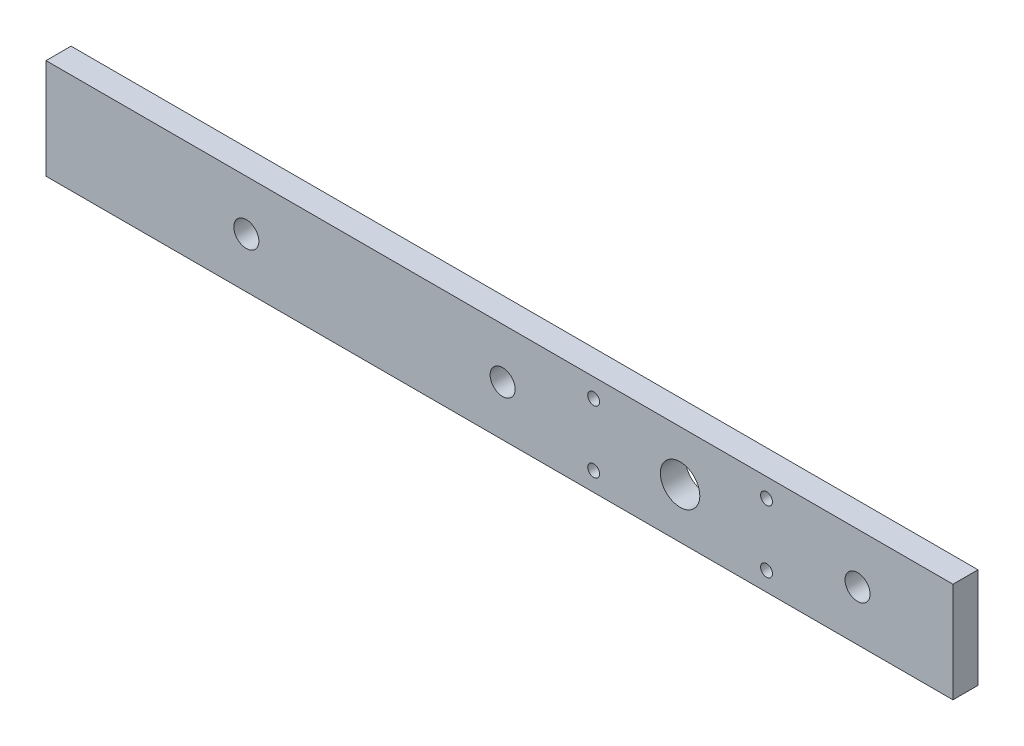
ISO-10303-21;
HEADER;
FILE_DESCRIPTION(('STEP AP214'),'2;1');
FILE_NAME('part.step','',(''),(''),'','','');
FILE_SCHEMA(('AUTOMOTIVE_DESIGN { 1 0 10303 214 1 1 1 1 }'));
ENDSEC;
DATA;
#1=APPLICATION_CONTEXT('core data for automotive mechanical design processes');
#2=APPLICATION_PROTOCOL_DEFINITION('international standard','automotive_design',2000,#1);
#3=PRODUCT_CONTEXT('',#1,'mechanical');
#4=PRODUCT('Part','Part','',(#3));
#5=PRODUCT_RELATED_PRODUCT_CATEGORY('part','',(#4));
#6=PRODUCT_DEFINITION_FORMATION('','',#4);
#7=PRODUCT_DEFINITION_CONTEXT('part definition',#1,'design');
#8=PRODUCT_DEFINITION('design','',#6,#7);
#9=PRODUCT_DEFINITION_SHAPE('','',#8);
#10=(LENGTH_UNIT() NAMED_UNIT(*) SI_UNIT(.MILLI.,.METRE.));
#11=(NAMED_UNIT(*) PLANE_ANGLE_UNIT() SI_UNIT($,.RADIAN.));
#12=(NAMED_UNIT(*) SI_UNIT($,.STERADIAN.) SOLID_ANGLE_UNIT());
#13=UNCERTAINTY_MEASURE_WITH_UNIT(LENGTH_MEASURE(1.E-05),#10,'distance_accuracy_value','');
#14=(GEOMETRIC_REPRESENTATION_CONTEXT(3) GLOBAL_UNCERTAINTY_ASSIGNED_CONTEXT((#13)) GLOBAL_UNIT_ASSIGNED_CONTEXT((#10,
#11,#12)) REPRESENTATION_CONTEXT('',''));
#15=CARTESIAN_POINT('',(0.,0.,0.));
#16=DIRECTION('',(0.,0.,1.));
#17=DIRECTION('',(1.,0.,0.));
#18=AXIS2_PLACEMENT_3D('',#15,#16,#17);
#19=CARTESIAN_POINT('',(304.8,0.,0.));
#20=DIRECTION('',(0.,0.,-1.));
#21=DIRECTION('',(-1.,0.,0.));
#22=AXIS2_PLACEMENT_3D('',#19,#20,#21);
#23=PLANE('',#22);
#24=CARTESIAN_POINT('',(138.879689783217,4.79999999999996,0.));
#25=DIRECTION('',(0.,0.,1.));
#26=DIRECTION('',(1.,0.,0.));
#27=AXIS2_PLACEMENT_3D('',#24,#25,#26);
#28=CIRCLE('',#27,1.5);
#29=CARTESIAN_POINT('',(140.379689783217,4.79999999999996,0.));
#30=VERTEX_POINT('',#29);
#31=EDGE_CURVE('E149',#30,#30,#28,.T.);
#32=ORIENTED_EDGE('',*,*,#31,.F.);
#33=EDGE_LOOP('',(#32));
#34=FACE_BOUND('',#33,.T.);
#35=CARTESIAN_POINT('',(182.720310216783,4.79999999999996,0.));
#36=DIRECTION('',(0.,0.,1.));
#37=DIRECTION('',(1.,0.,0.));
#38=AXIS2_PLACEMENT_3D('',#35,#36,#37);
#39=CIRCLE('',#38,1.5);
#40=CARTESIAN_POINT('',(184.220310216783,4.79999999999996,0.));
#41=VERTEX_POINT('',#40);
#42=EDGE_CURVE('E143',#41,#41,#39,.T.);
#43=ORIENTED_EDGE('',*,*,#42,.F.);
#44=EDGE_LOOP('',(#43));
#45=FACE_BOUND('',#44,.T.);
#46=CARTESIAN_POINT('',(182.720310216783,20.6,0.));
#47=DIRECTION('',(0.,0.,1.));
#48=DIRECTION('',(1.,0.,0.));
#49=AXIS2_PLACEMENT_3D('',#46,#47,#48);
#50=CIRCLE('',#49,1.5);
#51=CARTESIAN_POINT('',(184.220310216783,20.6,0.));
#52=VERTEX_POINT('',#51);
#53=EDGE_CURVE('E137',#52,#52,#50,.T.);
#54=ORIENTED_EDGE('',*,*,#53,.F.);
#55=EDGE_LOOP('',(#54));
#56=FACE_BOUND('',#55,.T.);
#57=CARTESIAN_POINT('',(138.879689783217,20.6,0.));
#58=DIRECTION('',(0.,0.,1.));
#59=DIRECTION('',(1.,0.,0.));
#60=AXIS2_PLACEMENT_3D('',#57,#58,#59);
#61=CIRCLE('',#60,1.5);
#62=CARTESIAN_POINT('',(140.379689783217,20.6,0.));
#63=VERTEX_POINT('',#62);
#64=EDGE_CURVE('E131',#63,#63,#61,.T.);
#65=ORIENTED_EDGE('',*,*,#64,.F.);
#66=EDGE_LOOP('',(#65));
#67=FACE_BOUND('',#66,.T.);
#68=CARTESIAN_POINT('',(205.8,12.7,0.));
#69=DIRECTION('',(0.,0.,1.));
#70=DIRECTION('',(1.,0.,0.));
#71=AXIS2_PLACEMENT_3D('',#68,#69,#70);
#72=CIRCLE('',#71,3.175);
#73=CARTESIAN_POINT('',(208.975,12.7,0.));
#74=VERTEX_POINT('',#73);
#75=EDGE_CURVE('E125',#74,#74,#72,.T.);
#76=ORIENTED_EDGE('',*,*,#75,.F.);
#77=EDGE_LOOP('',(#76));
#78=FACE_BOUND('',#77,.T.);
#79=CARTESIAN_POINT('',(115.8,12.7,0.));
#80=DIRECTION('',(0.,0.,1.));
#81=DIRECTION('',(1.,0.,0.));
#82=AXIS2_PLACEMENT_3D('',#79,#80,#81);
#83=CIRCLE('',#82,3.175);
#84=CARTESIAN_POINT('',(118.975,12.7,0.));
#85=VERTEX_POINT('',#84);
#86=EDGE_CURVE('E119',#85,#85,#83,.T.);
#87=ORIENTED_EDGE('',*,*,#86,.F.);
#88=EDGE_LOOP('',(#87));
#89=FACE_BOUND('',#88,.T.);
#90=CARTESIAN_POINT('',(50.8,12.7,0.));
#91=DIRECTION('',(0.,0.,1.));
#92=DIRECTION('',(1.,0.,0.));
#93=AXIS2_PLACEMENT_3D('',#90,#91,#92);
#94=CIRCLE('',#93,3.175);
#95=CARTESIAN_POINT('',(53.975,12.7,0.));
#96=VERTEX_POINT('',#95);
#97=EDGE_CURVE('E113',#96,#96,#94,.T.);
#98=ORIENTED_EDGE('',*,*,#97,.F.);
#99=EDGE_LOOP('',(#98));
#100=FACE_BOUND('',#99,.T.);
#101=CARTESIAN_POINT('',(160.8,12.7,0.));
#102=DIRECTION('',(0.,0.,1.));
#103=DIRECTION('',(1.,0.,0.));
#104=AXIS2_PLACEMENT_3D('',#101,#102,#103);
#105=CIRCLE('',#104,4.99999999999999);
#106=CARTESIAN_POINT('',(165.8,12.7,0.));
#107=VERTEX_POINT('',#106);
#108=EDGE_CURVE('E107',#107,#107,#105,.T.);
#109=ORIENTED_EDGE('',*,*,#108,.F.);
#110=EDGE_LOOP('',(#109));
#111=FACE_BOUND('',#110,.T.);
#112=DIRECTION('',(-1.,0.,0.));
#113=VECTOR('',#112,1.);
#114=CARTESIAN_POINT('',(304.8,0.,0.));
#115=LINE('',#114,#113);
#116=CARTESIAN_POINT('',(230.,0.,0.));
#117=VERTEX_POINT('',#116);
#118=CARTESIAN_POINT('',(0.,0.,0.));
#119=VERTEX_POINT('',#118);
#120=EDGE_CURVE('E11',#117,#119,#115,.T.);
#121=ORIENTED_EDGE('',*,*,#120,.F.);
#122=DIRECTION('',(0.,-1.,0.));
#123=VECTOR('',#122,1.);
#124=CARTESIAN_POINT('',(230.,25.4,0.));
#125=LINE('',#124,#123);
#126=CARTESIAN_POINT('',(230.,25.4,0.));
#127=VERTEX_POINT('',#126);
#128=EDGE_CURVE('E72',#127,#117,#125,.T.);
#129=ORIENTED_EDGE('',*,*,#128,.F.);
#130=DIRECTION('',(-1.,0.,0.));
#131=VECTOR('',#130,1.);
#132=CARTESIAN_POINT('',(304.8,25.4,0.));
#133=LINE('',#132,#131);
#134=CARTESIAN_POINT('',(0.,25.4,0.));
#135=VERTEX_POINT('',#134);
#136=EDGE_CURVE('E54',#127,#135,#133,.T.);
#137=ORIENTED_EDGE('',*,*,#136,.T.);
#138=DIRECTION('',(0.,-1.,0.));
#139=VECTOR('',#138,1.);
#140=CARTESIAN_POINT('',(0.,0.,0.));
#141=LINE('',#140,#139);
#142=EDGE_CURVE('E101',#135,#119,#141,.T.);
#143=ORIENTED_EDGE('',*,*,#142,.T.);
#144=EDGE_LOOP('',(#121,#129,#137,#143));
#145=FACE_BOUND('',#144,.T.);
#146=ADVANCED_FACE('F32',(#34,#45,#56,#67,#78,#89,#100,#111,#145),#23,.F.);
#147=CARTESIAN_POINT('',(304.8,0.,0.));
#148=DIRECTION('',(0.,1.,0.));
#149=DIRECTION('',(0.,0.,1.));
#150=AXIS2_PLACEMENT_3D('',#147,#148,#149);
#151=PLANE('',#150);
#152=DIRECTION('',(-1.,0.,0.));
#153=VECTOR('',#152,1.);
#154=CARTESIAN_POINT('',(304.8,0.,-6.35));
#155=LINE('',#154,#153);
#156=CARTESIAN_POINT('',(230.,0.,-6.35));
#157=VERTEX_POINT('',#156);
#158=CARTESIAN_POINT('',(0.,0.,-6.35));
#159=VERTEX_POINT('',#158);
#160=EDGE_CURVE('E39',#157,#159,#155,.T.);
#161=ORIENTED_EDGE('',*,*,#160,.F.);
#162=DIRECTION('',(0.,0.,1.));
#163=VECTOR('',#162,1.);
#164=CARTESIAN_POINT('',(230.,0.,-10.));
#165=LINE('',#164,#163);
#166=EDGE_CURVE('E76',#157,#117,#165,.T.);
#167=ORIENTED_EDGE('',*,*,#166,.T.);
#168=ORIENTED_EDGE('',*,*,#120,.T.);
#169=DIRECTION('',(0.,0.,-1.));
#170=VECTOR('',#169,1.);
#171=CARTESIAN_POINT('',(0.,0.,0.));
#172=LINE('',#171,#170);
#173=EDGE_CURVE('E98',#119,#159,#172,.T.);
#174=ORIENTED_EDGE('',*,*,#173,.T.);
#175=EDGE_LOOP('',(#161,#167,#168,#174));
#176=FACE_BOUND('',#175,.T.);
#177=ADVANCED_FACE('F99',(#176),#151,.F.);
#178=CARTESIAN_POINT('',(304.8,0.,-6.35));
#179=DIRECTION('',(0.,0.,1.));
#180=DIRECTION('',(0.,-1.,0.));
#181=AXIS2_PLACEMENT_3D('',#178,#179,#180);
#182=PLANE('',#181);
#183=CARTESIAN_POINT('',(138.879689783217,4.79999999999996,-6.35));
#184=DIRECTION('',(0.,0.,1.));
#185=DIRECTION('',(1.,0.,0.));
#186=AXIS2_PLACEMENT_3D('',#183,#184,#185);
#187=CIRCLE('',#186,1.5);
#188=CARTESIAN_POINT('',(140.379689783217,4.79999999999996,-6.35));
#189=VERTEX_POINT('',#188);
#190=EDGE_CURVE('E146',#189,#189,#187,.T.);
#191=ORIENTED_EDGE('',*,*,#190,.T.);
#192=EDGE_LOOP('',(#191));
#193=FACE_BOUND('',#192,.T.);
#194=CARTESIAN_POINT('',(182.720310216783,4.79999999999996,-6.35));
#195=DIRECTION('',(0.,0.,1.));
#196=DIRECTION('',(1.,0.,0.));
#197=AXIS2_PLACEMENT_3D('',#194,#195,#196);
#198=CIRCLE('',#197,1.5);
#199=CARTESIAN_POINT('',(184.220310216783,4.79999999999996,-6.35));
#200=VERTEX_POINT('',#199);
#201=EDGE_CURVE('E140',#200,#200,#198,.T.);
#202=ORIENTED_EDGE('',*,*,#201,.T.);
#203=EDGE_LOOP('',(#202));
#204=FACE_BOUND('',#203,.T.);
#205=CARTESIAN_POINT('',(182.720310216783,20.6,-6.35));
#206=DIRECTION('',(0.,0.,1.));
#207=DIRECTION('',(1.,0.,0.));
#208=AXIS2_PLACEMENT_3D('',#205,#206,#207);
#209=CIRCLE('',#208,1.5);
#210=CARTESIAN_POINT('',(184.220310216783,20.6,-6.35));
#211=VERTEX_POINT('',#210);
#212=EDGE_CURVE('E134',#211,#211,#209,.T.);
#213=ORIENTED_EDGE('',*,*,#212,.T.);
#214=EDGE_LOOP('',(#213));
#215=FACE_BOUND('',#214,.T.);
#216=CARTESIAN_POINT('',(138.879689783217,20.6,-6.35));
#217=DIRECTION('',(0.,0.,1.));
#218=DIRECTION('',(1.,0.,0.));
#219=AXIS2_PLACEMENT_3D('',#216,#217,#218);
#220=CIRCLE('',#219,1.5);
#221=CARTESIAN_POINT('',(140.379689783217,20.6,-6.35));
#222=VERTEX_POINT('',#221);
#223=EDGE_CURVE('E128',#222,#222,#220,.T.);
#224=ORIENTED_EDGE('',*,*,#223,.T.);
#225=EDGE_LOOP('',(#224));
#226=FACE_BOUND('',#225,.T.);
#227=CARTESIAN_POINT('',(205.8,12.7,-6.35));
#228=DIRECTION('',(0.,0.,1.));
#229=DIRECTION('',(1.,0.,0.));
#230=AXIS2_PLACEMENT_3D('',#227,#228,#229);
#231=CIRCLE('',#230,3.175);
#232=CARTESIAN_POINT('',(208.975,12.7,-6.35));
#233=VERTEX_POINT('',#232);
#234=EDGE_CURVE('E122',#233,#233,#231,.T.);
#235=ORIENTED_EDGE('',*,*,#234,.T.);
#236=EDGE_LOOP('',(#235));
#237=FACE_BOUND('',#236,.T.);
#238=CARTESIAN_POINT('',(115.8,12.7,-6.35));
#239=DIRECTION('',(0.,0.,1.));
#240=DIRECTION('',(1.,0.,0.));
#241=AXIS2_PLACEMENT_3D('',#238,#239,#240);
#242=CIRCLE('',#241,3.175);
#243=CARTESIAN_POINT('',(118.975,12.7,-6.35));
#244=VERTEX_POINT('',#243);
#245=EDGE_CURVE('E116',#244,#244,#242,.T.);
#246=ORIENTED_EDGE('',*,*,#245,.T.);
#247=EDGE_LOOP('',(#246));
#248=FACE_BOUND('',#247,.T.);
#249=CARTESIAN_POINT('',(50.8,12.7,-6.35));
#250=DIRECTION('',(0.,0.,1.));
#251=DIRECTION('',(1.,0.,0.));
#252=AXIS2_PLACEMENT_3D('',#249,#250,#251);
#253=CIRCLE('',#252,3.175);
#254=CARTESIAN_POINT('',(53.975,12.7,-6.35));
#255=VERTEX_POINT('',#254);
#256=EDGE_CURVE('E110',#255,#255,#253,.T.);
#257=ORIENTED_EDGE('',*,*,#256,.T.);
#258=EDGE_LOOP('',(#257));
#259=FACE_BOUND('',#258,.T.);
#260=CARTESIAN_POINT('',(160.8,12.7,-6.35));
#261=DIRECTION('',(0.,0.,1.));
#262=DIRECTION('',(1.,0.,0.));
#263=AXIS2_PLACEMENT_3D('',#260,#261,#262);
#264=CIRCLE('',#263,4.99999999999999);
#265=CARTESIAN_POINT('',(165.8,12.7,-6.35));
#266=VERTEX_POINT('',#265);
#267=EDGE_CURVE('E106',#266,#266,#264,.T.);
#268=ORIENTED_EDGE('',*,*,#267,.T.);
#269=EDGE_LOOP('',(#268));
#270=FACE_BOUND('',#269,.T.);
#271=DIRECTION('',(-1.,0.,0.));
#272=VECTOR('',#271,1.);
#273=CARTESIAN_POINT('',(304.8,25.4,-6.34999999999999));
#274=LINE('',#273,#272);
#275=CARTESIAN_POINT('',(230.,25.4,-6.34999999999999));
#276=VERTEX_POINT('',#275);
#277=CARTESIAN_POINT('',(0.,25.4,-6.34999999999999));
#278=VERTEX_POINT('',#277);
#279=EDGE_CURVE('E84',#276,#278,#274,.T.);
#280=ORIENTED_EDGE('',*,*,#279,.F.);
#281=DIRECTION('',(0.,-1.,0.));
#282=VECTOR('',#281,1.);
#283=CARTESIAN_POINT('',(230.,0.,-6.35));
#284=LINE('',#283,#282);
#285=EDGE_CURVE('E46',#276,#157,#284,.T.);
#286=ORIENTED_EDGE('',*,*,#285,.T.);
#287=ORIENTED_EDGE('',*,*,#160,.T.);
#288=DIRECTION('',(0.,1.,0.));
#289=VECTOR('',#288,1.);
#290=CARTESIAN_POINT('',(0.,0.,-6.35));
#291=LINE('',#290,#289);
#292=EDGE_CURVE('E87',#159,#278,#291,.T.);
#293=ORIENTED_EDGE('',*,*,#292,.T.);
#294=EDGE_LOOP('',(#280,#286,#287,#293));
#295=FACE_BOUND('',#294,.T.);
#296=ADVANCED_FACE('F94',(#193,#204,#215,#226,#237,#248,#259,#270,#295),#182,.F.);
#297=CARTESIAN_POINT('',(304.8,25.4,0.));
#298=DIRECTION('',(0.,-1.,0.));
#299=DIRECTION('',(0.,0.,-1.));
#300=AXIS2_PLACEMENT_3D('',#297,#298,#299);
#301=PLANE('',#300);
#302=ORIENTED_EDGE('',*,*,#136,.F.);
#303=DIRECTION('',(0.,0.,1.));
#304=VECTOR('',#303,1.);
#305=CARTESIAN_POINT('',(230.,25.4,-10.));
#306=LINE('',#305,#304);
#307=EDGE_CURVE('E70',#276,#127,#306,.T.);
#308=ORIENTED_EDGE('',*,*,#307,.F.);
#309=ORIENTED_EDGE('',*,*,#279,.T.);
#310=DIRECTION('',(0.,0.,1.));
#311=VECTOR('',#310,1.);
#312=CARTESIAN_POINT('',(0.,25.4,0.));
#313=LINE('',#312,#311);
#314=EDGE_CURVE('E82',#278,#135,#313,.T.);
#315=ORIENTED_EDGE('',*,*,#314,.T.);
#316=EDGE_LOOP('',(#302,#308,#309,#315));
#317=FACE_BOUND('',#316,.T.);
#318=ADVANCED_FACE('F80',(#317),#301,.F.);
#319=CARTESIAN_POINT('',(0.,0.,0.));
#320=DIRECTION('',(-1.,0.,0.));
#321=DIRECTION('',(0.,0.,1.));
#322=AXIS2_PLACEMENT_3D('',#319,#320,#321);
#323=PLANE('',#322);
#324=ORIENTED_EDGE('',*,*,#142,.F.);
#325=ORIENTED_EDGE('',*,*,#314,.F.);
#326=ORIENTED_EDGE('',*,*,#292,.F.);
#327=ORIENTED_EDGE('',*,*,#173,.F.);
#328=EDGE_LOOP('',(#324,#325,#326,#327));
#329=FACE_BOUND('',#328,.T.);
#330=ADVANCED_FACE('F103',(#329),#323,.T.);
#331=CARTESIAN_POINT('',(160.8,12.7,-6.35));
#332=DIRECTION('',(0.,0.,1.));
#333=DIRECTION('',(1.,0.,0.));
#334=AXIS2_PLACEMENT_3D('',#331,#332,#333);
#335=CYLINDRICAL_SURFACE('',#334,4.99999999999999);
#336=ORIENTED_EDGE('',*,*,#267,.F.);
#337=EDGE_LOOP('',(#336));
#338=FACE_BOUND('',#337,.T.);
#339=ORIENTED_EDGE('',*,*,#108,.T.);
#340=EDGE_LOOP('',(#339));
#341=FACE_BOUND('',#340,.T.);
#342=ADVANCED_FACE('F182',(#338,#341),#335,.F.);
#343=CARTESIAN_POINT('',(50.8,12.7,-6.35));
#344=DIRECTION('',(0.,0.,1.));
#345=DIRECTION('',(1.,0.,0.));
#346=AXIS2_PLACEMENT_3D('',#343,#344,#345);
#347=CYLINDRICAL_SURFACE('',#346,3.175);
#348=ORIENTED_EDGE('',*,*,#256,.F.);
#349=EDGE_LOOP('',(#348));
#350=FACE_BOUND('',#349,.T.);
#351=ORIENTED_EDGE('',*,*,#97,.T.);
#352=EDGE_LOOP('',(#351));
#353=FACE_BOUND('',#352,.T.);
#354=ADVANCED_FACE('F184',(#350,#353),#347,.F.);
#355=CARTESIAN_POINT('',(115.8,12.7,-6.35));
#356=DIRECTION('',(0.,0.,1.));
#357=DIRECTION('',(1.,0.,0.));
#358=AXIS2_PLACEMENT_3D('',#355,#356,#357);
#359=CYLINDRICAL_SURFACE('',#358,3.175);
#360=ORIENTED_EDGE('',*,*,#245,.F.);
#361=EDGE_LOOP('',(#360));
#362=FACE_BOUND('',#361,.T.);
#363=ORIENTED_EDGE('',*,*,#86,.T.);
#364=EDGE_LOOP('',(#363));
#365=FACE_BOUND('',#364,.T.);
#366=ADVANCED_FACE('F191',(#362,#365),#359,.F.);
#367=CARTESIAN_POINT('',(205.8,12.7,-6.35));
#368=DIRECTION('',(0.,0.,1.));
#369=DIRECTION('',(1.,0.,0.));
#370=AXIS2_PLACEMENT_3D('',#367,#368,#369);
#371=CYLINDRICAL_SURFACE('',#370,3.175);
#372=ORIENTED_EDGE('',*,*,#234,.F.);
#373=EDGE_LOOP('',(#372));
#374=FACE_BOUND('',#373,.T.);
#375=ORIENTED_EDGE('',*,*,#75,.T.);
#376=EDGE_LOOP('',(#375));
#377=FACE_BOUND('',#376,.T.);
#378=ADVANCED_FACE('F238',(#374,#377),#371,.F.);
#379=CARTESIAN_POINT('',(138.879689783217,20.6,-6.35));
#380=DIRECTION('',(0.,0.,1.));
#381=DIRECTION('',(1.,0.,0.));
#382=AXIS2_PLACEMENT_3D('',#379,#380,#381);
#383=CYLINDRICAL_SURFACE('',#382,1.5);
#384=ORIENTED_EDGE('',*,*,#223,.F.);
#385=EDGE_LOOP('',(#384));
#386=FACE_BOUND('',#385,.T.);
#387=ORIENTED_EDGE('',*,*,#64,.T.);
#388=EDGE_LOOP('',(#387));
#389=FACE_BOUND('',#388,.T.);
#390=ADVANCED_FACE('F247',(#386,#389),#383,.F.);
#391=CARTESIAN_POINT('',(182.720310216783,20.6,-6.35));
#392=DIRECTION('',(0.,0.,1.));
#393=DIRECTION('',(1.,0.,0.));
#394=AXIS2_PLACEMENT_3D('',#391,#392,#393);
#395=CYLINDRICAL_SURFACE('',#394,1.5);
#396=ORIENTED_EDGE('',*,*,#212,.F.);
#397=EDGE_LOOP('',(#396));
#398=FACE_BOUND('',#397,.T.);
#399=ORIENTED_EDGE('',*,*,#53,.T.);
#400=EDGE_LOOP('',(#399));
#401=FACE_BOUND('',#400,.T.);
#402=ADVANCED_FACE('F257',(#398,#401),#395,.F.);
#403=CARTESIAN_POINT('',(182.720310216783,4.79999999999996,-6.35));
#404=DIRECTION('',(0.,0.,1.));
#405=DIRECTION('',(1.,0.,0.));
#406=AXIS2_PLACEMENT_3D('',#403,#404,#405);
#407=CYLINDRICAL_SURFACE('',#406,1.5);
#408=ORIENTED_EDGE('',*,*,#201,.F.);
#409=EDGE_LOOP('',(#408));
#410=FACE_BOUND('',#409,.T.);
#411=ORIENTED_EDGE('',*,*,#42,.T.);
#412=EDGE_LOOP('',(#411));
#413=FACE_BOUND('',#412,.T.);
#414=ADVANCED_FACE('F162',(#410,#413),#407,.F.);
#415=CARTESIAN_POINT('',(138.879689783217,4.79999999999996,-6.35));
#416=DIRECTION('',(0.,0.,1.));
#417=DIRECTION('',(1.,0.,0.));
#418=AXIS2_PLACEMENT_3D('',#415,#416,#417);
#419=CYLINDRICAL_SURFACE('',#418,1.5);
#420=ORIENTED_EDGE('',*,*,#190,.F.);
#421=EDGE_LOOP('',(#420));
#422=FACE_BOUND('',#421,.T.);
#423=ORIENTED_EDGE('',*,*,#31,.T.);
#424=EDGE_LOOP('',(#423));
#425=FACE_BOUND('',#424,.T.);
#426=ADVANCED_FACE('F159',(#422,#425),#419,.F.);
#427=CARTESIAN_POINT('',(230.,25.4,-10.));
#428=DIRECTION('',(-1.,0.,0.));
#429=DIRECTION('',(0.,0.,1.));
#430=AXIS2_PLACEMENT_3D('',#427,#428,#429);
#431=PLANE('',#430);
#432=ORIENTED_EDGE('',*,*,#307,.T.);
#433=ORIENTED_EDGE('',*,*,#128,.T.);
#434=ORIENTED_EDGE('',*,*,#166,.F.);
#435=ORIENTED_EDGE('',*,*,#285,.F.);
#436=EDGE_LOOP('',(#432,#433,#434,#435));
#437=FACE_BOUND('',#436,.T.);
#438=ADVANCED_FACE('F71',(#437),#431,.F.);
#439=CLOSED_SHELL('',(#146,#177,#296,#318,#330,#342,#354,#366,#378,#390,#402,#414,#426,#438));
#440=MANIFOLD_SOLID_BREP('B2',#439);
#441=ADVANCED_BREP_SHAPE_REPRESENTATION('',(#18,#440),#14);
#442=SHAPE_DEFINITION_REPRESENTATION(#9,#441);
ENDSEC;
END-ISO-10303-21;
